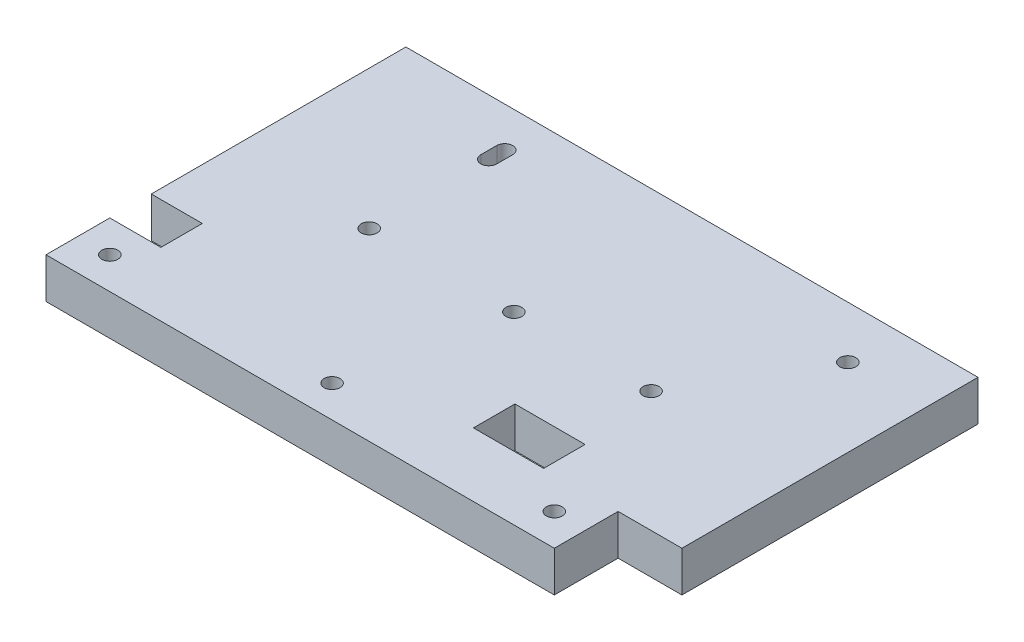
ISO-10303-21;
HEADER;
FILE_DESCRIPTION(('STEP AP214'),'2;1');
FILE_NAME('part.step','',(''),(''),'','','');
FILE_SCHEMA(('AUTOMOTIVE_DESIGN { 1 0 10303 214 1 1 1 1 }'));
ENDSEC;
DATA;
#1=APPLICATION_CONTEXT('core data for automotive mechanical design processes');
#2=APPLICATION_PROTOCOL_DEFINITION('international standard','automotive_design',2000,#1);
#3=PRODUCT_CONTEXT('',#1,'mechanical');
#4=PRODUCT('Part','Part','',(#3));
#5=PRODUCT_RELATED_PRODUCT_CATEGORY('part','',(#4));
#6=PRODUCT_DEFINITION_FORMATION('','',#4);
#7=PRODUCT_DEFINITION_CONTEXT('part definition',#1,'design');
#8=PRODUCT_DEFINITION('design','',#6,#7);
#9=PRODUCT_DEFINITION_SHAPE('','',#8);
#10=(LENGTH_UNIT() NAMED_UNIT(*) SI_UNIT(.MILLI.,.METRE.));
#11=(NAMED_UNIT(*) PLANE_ANGLE_UNIT() SI_UNIT($,.RADIAN.));
#12=(NAMED_UNIT(*) SI_UNIT($,.STERADIAN.) SOLID_ANGLE_UNIT());
#13=UNCERTAINTY_MEASURE_WITH_UNIT(LENGTH_MEASURE(1.E-05),#10,'distance_accuracy_value','');
#14=(GEOMETRIC_REPRESENTATION_CONTEXT(3) GLOBAL_UNCERTAINTY_ASSIGNED_CONTEXT((#13)) GLOBAL_UNIT_ASSIGNED_CONTEXT((#10,
#11,#12)) REPRESENTATION_CONTEXT('',''));
#15=CARTESIAN_POINT('',(0.,0.,0.));
#16=DIRECTION('',(0.,0.,1.));
#17=DIRECTION('',(1.,0.,0.));
#18=AXIS2_PLACEMENT_3D('',#15,#16,#17);
#19=CARTESIAN_POINT('',(0.,6.35,0.));
#20=DIRECTION('',(0.,-1.,0.));
#21=DIRECTION('',(0.,0.,-1.));
#22=AXIS2_PLACEMENT_3D('',#19,#20,#21);
#23=PLANE('',#22);
#24=CARTESIAN_POINT('',(149.35,6.35,-10.));
#25=DIRECTION('',(0.,1.,0.));
#26=DIRECTION('',(0.,0.,1.));
#27=AXIS2_PLACEMENT_3D('',#24,#25,#26);
#28=CIRCLE('',#27,2.5);
#29=CARTESIAN_POINT('',(149.35,6.35,-7.50000000000001));
#30=VERTEX_POINT('',#29);
#31=EDGE_CURVE('E193',#30,#30,#28,.T.);
#32=ORIENTED_EDGE('',*,*,#31,.F.);
#33=EDGE_LOOP('',(#32));
#34=FACE_BOUND('',#33,.T.);
#35=CARTESIAN_POINT('',(79.675,6.35,-10.));
#36=DIRECTION('',(0.,1.,0.));
#37=DIRECTION('',(0.,0.,1.));
#38=AXIS2_PLACEMENT_3D('',#35,#36,#37);
#39=CIRCLE('',#38,2.5);
#40=CARTESIAN_POINT('',(79.675,6.35,-7.50000000000001));
#41=VERTEX_POINT('',#40);
#42=EDGE_CURVE('E199',#41,#41,#39,.T.);
#43=ORIENTED_EDGE('',*,*,#42,.F.);
#44=EDGE_LOOP('',(#43));
#45=FACE_BOUND('',#44,.T.);
#46=CARTESIAN_POINT('',(10.,6.35,-10.));
#47=DIRECTION('',(0.,1.,0.));
#48=DIRECTION('',(0.,0.,1.));
#49=AXIS2_PLACEMENT_3D('',#46,#47,#48);
#50=CIRCLE('',#49,2.5);
#51=CARTESIAN_POINT('',(10.,6.35,-7.5));
#52=VERTEX_POINT('',#51);
#53=EDGE_CURVE('E205',#52,#52,#50,.T.);
#54=ORIENTED_EDGE('',*,*,#53,.F.);
#55=EDGE_LOOP('',(#54));
#56=FACE_BOUND('',#55,.T.);
#57=CARTESIAN_POINT('',(43.4871752699051,6.35,-95.32));
#58=DIRECTION('',(0.,1.,0.));
#59=DIRECTION('',(0.,0.,1.));
#60=AXIS2_PLACEMENT_3D('',#57,#58,#59);
#61=CIRCLE('',#60,2.5);
#62=CARTESIAN_POINT('',(40.9871752699051,6.35,-95.32));
#63=VERTEX_POINT('',#62);
#64=CARTESIAN_POINT('',(45.9871752699051,6.35,-95.32));
#65=VERTEX_POINT('',#64);
#66=EDGE_CURVE('E211',#63,#65,#61,.T.);
#67=ORIENTED_EDGE('',*,*,#66,.F.);
#68=DIRECTION('',(0.,0.,1.));
#69=VECTOR('',#68,1.);
#70=CARTESIAN_POINT('',(40.9871752699051,6.35,-95.32));
#71=LINE('',#70,#69);
#72=CARTESIAN_POINT('',(40.9871752699051,6.35,-100.32));
#73=VERTEX_POINT('',#72);
#74=EDGE_CURVE('E219',#73,#63,#71,.T.);
#75=ORIENTED_EDGE('',*,*,#74,.F.);
#76=CARTESIAN_POINT('',(43.4871752699051,6.35,-100.32));
#77=DIRECTION('',(0.,1.,0.));
#78=DIRECTION('',(0.,0.,1.));
#79=AXIS2_PLACEMENT_3D('',#76,#77,#78);
#80=CIRCLE('',#79,2.5);
#81=CARTESIAN_POINT('',(45.9871752699051,6.35,-100.32));
#82=VERTEX_POINT('',#81);
#83=EDGE_CURVE('E216',#82,#73,#80,.T.);
#84=ORIENTED_EDGE('',*,*,#83,.F.);
#85=DIRECTION('',(0.,0.,-1.));
#86=VECTOR('',#85,1.);
#87=CARTESIAN_POINT('',(45.9871752699051,6.35,-95.32));
#88=LINE('',#87,#86);
#89=EDGE_CURVE('E213',#65,#82,#88,.T.);
#90=ORIENTED_EDGE('',*,*,#89,.F.);
#91=EDGE_LOOP('',(#67,#75,#84,#90));
#92=FACE_BOUND('',#91,.T.);
#93=DIRECTION('',(0.,0.,1.));
#94=VECTOR('',#93,1.);
#95=CARTESIAN_POINT('',(0.,6.35,0.));
#96=LINE('',#95,#94);
#97=CARTESIAN_POINT('',(0.,6.35,-20.));
#98=VERTEX_POINT('',#97);
#99=CARTESIAN_POINT('',(0.,6.35,0.));
#100=VERTEX_POINT('',#99);
#101=EDGE_CURVE('E266',#98,#100,#96,.T.);
#102=ORIENTED_EDGE('',*,*,#101,.T.);
#103=DIRECTION('',(1.,0.,0.));
#104=VECTOR('',#103,1.);
#105=CARTESIAN_POINT('',(0.,6.35,0.));
#106=LINE('',#105,#104);
#107=CARTESIAN_POINT('',(159.35,6.35,0.));
#108=VERTEX_POINT('',#107);
#109=EDGE_CURVE('E269',#100,#108,#106,.T.);
#110=ORIENTED_EDGE('',*,*,#109,.T.);
#111=DIRECTION('',(0.,0.,-1.));
#112=VECTOR('',#111,1.);
#113=CARTESIAN_POINT('',(159.35,6.35,0.));
#114=LINE('',#113,#112);
#115=CARTESIAN_POINT('',(159.35,6.35,-20.));
#116=VERTEX_POINT('',#115);
#117=EDGE_CURVE('E272',#108,#116,#114,.T.);
#118=ORIENTED_EDGE('',*,*,#117,.T.);
#119=DIRECTION('',(1.,0.,0.));
#120=VECTOR('',#119,1.);
#121=CARTESIAN_POINT('',(159.35,6.35,-20.));
#122=LINE('',#121,#120);
#123=CARTESIAN_POINT('',(179.35,6.35,-20.));
#124=VERTEX_POINT('',#123);
#125=EDGE_CURVE('E274',#116,#124,#122,.T.);
#126=ORIENTED_EDGE('',*,*,#125,.T.);
#127=DIRECTION('',(0.,0.,-1.));
#128=VECTOR('',#127,1.);
#129=CARTESIAN_POINT('',(179.35,6.35,-112.82));
#130=LINE('',#129,#128);
#131=CARTESIAN_POINT('',(179.35,6.35,-112.82));
#132=VERTEX_POINT('',#131);
#133=EDGE_CURVE('E276',#124,#132,#130,.T.);
#134=ORIENTED_EDGE('',*,*,#133,.T.);
#135=DIRECTION('',(-1.,0.,0.));
#136=VECTOR('',#135,1.);
#137=CARTESIAN_POINT('',(0.,6.35,-112.82));
#138=LINE('',#137,#136);
#139=CARTESIAN_POINT('',(0.,6.35,-112.82));
#140=VERTEX_POINT('',#139);
#141=EDGE_CURVE('E278',#132,#140,#138,.T.);
#142=ORIENTED_EDGE('',*,*,#141,.T.);
#143=DIRECTION('',(0.,0.,1.));
#144=VECTOR('',#143,1.);
#145=CARTESIAN_POINT('',(0.,6.35,-33.));
#146=LINE('',#145,#144);
#147=CARTESIAN_POINT('',(0.,6.35,-33.));
#148=VERTEX_POINT('',#147);
#149=EDGE_CURVE('E280',#140,#148,#146,.T.);
#150=ORIENTED_EDGE('',*,*,#149,.T.);
#151=DIRECTION('',(1.,0.,0.));
#152=VECTOR('',#151,1.);
#153=CARTESIAN_POINT('',(16.,6.35,-33.));
#154=LINE('',#153,#152);
#155=CARTESIAN_POINT('',(16.,6.35,-33.));
#156=VERTEX_POINT('',#155);
#157=EDGE_CURVE('E282',#148,#156,#154,.T.);
#158=ORIENTED_EDGE('',*,*,#157,.T.);
#159=DIRECTION('',(0.,0.,1.));
#160=VECTOR('',#159,1.);
#161=CARTESIAN_POINT('',(16.,6.35,-20.));
#162=LINE('',#161,#160);
#163=CARTESIAN_POINT('',(16.,6.35,-20.));
#164=VERTEX_POINT('',#163);
#165=EDGE_CURVE('E284',#156,#164,#162,.T.);
#166=ORIENTED_EDGE('',*,*,#165,.T.);
#167=DIRECTION('',(-1.,0.,0.));
#168=VECTOR('',#167,1.);
#169=CARTESIAN_POINT('',(0.,6.35,-20.));
#170=LINE('',#169,#168);
#171=EDGE_CURVE('E286',#164,#98,#170,.T.);
#172=ORIENTED_EDGE('',*,*,#171,.T.);
#173=EDGE_LOOP('',(#102,#110,#118,#126,#134,#142,#150,#158,#166,#172));
#174=FACE_BOUND('',#173,.T.);
#175=CARTESIAN_POINT('',(43.4871752699051,6.35,-57.82));
#176=DIRECTION('',(0.,1.,0.));
#177=DIRECTION('',(0.,0.,1.));
#178=AXIS2_PLACEMENT_3D('',#175,#176,#177);
#179=CIRCLE('',#178,2.49999999999997);
#180=CARTESIAN_POINT('',(43.4871752699051,6.35,-55.32));
#181=VERTEX_POINT('',#180);
#182=EDGE_CURVE('E260',#181,#181,#179,.T.);
#183=ORIENTED_EDGE('',*,*,#182,.F.);
#184=EDGE_LOOP('',(#183));
#185=FACE_BOUND('',#184,.T.);
#186=CARTESIAN_POINT('',(88.8628247300949,6.35,-57.82));
#187=DIRECTION('',(0.,1.,0.));
#188=DIRECTION('',(0.,0.,1.));
#189=AXIS2_PLACEMENT_3D('',#186,#187,#188);
#190=CIRCLE('',#189,2.5);
#191=CARTESIAN_POINT('',(88.8628247300949,6.35,-55.32));
#192=VERTEX_POINT('',#191);
#193=EDGE_CURVE('E254',#192,#192,#190,.T.);
#194=ORIENTED_EDGE('',*,*,#193,.F.);
#195=EDGE_LOOP('',(#194));
#196=FACE_BOUND('',#195,.T.);
#197=CARTESIAN_POINT('',(131.862824730095,6.35,-57.82));
#198=DIRECTION('',(0.,1.,0.));
#199=DIRECTION('',(0.,0.,1.));
#200=AXIS2_PLACEMENT_3D('',#197,#198,#199);
#201=CIRCLE('',#200,2.50000000000002);
#202=CARTESIAN_POINT('',(131.862824730095,6.35,-55.32));
#203=VERTEX_POINT('',#202);
#204=EDGE_CURVE('E248',#203,#203,#201,.T.);
#205=ORIENTED_EDGE('',*,*,#204,.F.);
#206=EDGE_LOOP('',(#205));
#207=FACE_BOUND('',#206,.T.);
#208=CARTESIAN_POINT('',(154.85,6.35,-96.5057825707412));
#209=DIRECTION('',(0.,1.,0.));
#210=DIRECTION('',(0.,0.,1.));
#211=AXIS2_PLACEMENT_3D('',#208,#209,#210);
#212=CIRCLE('',#211,2.5);
#213=CARTESIAN_POINT('',(154.85,6.35,-94.0057825707412));
#214=VERTEX_POINT('',#213);
#215=EDGE_CURVE('E242',#214,#214,#212,.T.);
#216=ORIENTED_EDGE('',*,*,#215,.F.);
#217=EDGE_LOOP('',(#216));
#218=FACE_BOUND('',#217,.T.);
#219=DIRECTION('',(0.,0.,1.));
#220=VECTOR('',#219,1.);
#221=CARTESIAN_POINT('',(114.,6.35,-33.));
#222=LINE('',#221,#220);
#223=CARTESIAN_POINT('',(114.,6.35,-33.));
#224=VERTEX_POINT('',#223);
#225=CARTESIAN_POINT('',(114.,6.35,-20.));
#226=VERTEX_POINT('',#225);
#227=EDGE_CURVE('E157',#224,#226,#222,.T.);
#228=ORIENTED_EDGE('',*,*,#227,.F.);
#229=DIRECTION('',(-1.,0.,0.));
#230=VECTOR('',#229,1.);
#231=CARTESIAN_POINT('',(114.,6.35,-33.));
#232=LINE('',#231,#230);
#233=CARTESIAN_POINT('',(136.,6.35,-33.));
#234=VERTEX_POINT('',#233);
#235=EDGE_CURVE('E179',#234,#224,#232,.T.);
#236=ORIENTED_EDGE('',*,*,#235,.F.);
#237=DIRECTION('',(0.,0.,-1.));
#238=VECTOR('',#237,1.);
#239=CARTESIAN_POINT('',(136.,6.35,-33.));
#240=LINE('',#239,#238);
#241=CARTESIAN_POINT('',(136.,6.35,-20.));
#242=VERTEX_POINT('',#241);
#243=EDGE_CURVE('E177',#242,#234,#240,.T.);
#244=ORIENTED_EDGE('',*,*,#243,.F.);
#245=DIRECTION('',(1.,0.,0.));
#246=VECTOR('',#245,1.);
#247=CARTESIAN_POINT('',(114.,6.35,-20.));
#248=LINE('',#247,#246);
#249=EDGE_CURVE('E165',#226,#242,#248,.T.);
#250=ORIENTED_EDGE('',*,*,#249,.F.);
#251=EDGE_LOOP('',(#228,#236,#244,#250));
#252=FACE_BOUND('',#251,.T.);
#253=ADVANCED_FACE('F32',(#34,#45,#56,#92,#174,#185,#196,#207,#218,#252),#23,.F.);
#254=CARTESIAN_POINT('',(0.,-6.35,0.));
#255=DIRECTION('',(0.,-1.,0.));
#256=DIRECTION('',(0.,0.,-1.));
#257=AXIS2_PLACEMENT_3D('',#254,#255,#256);
#258=PLANE('',#257);
#259=CARTESIAN_POINT('',(79.675,-6.35,-10.));
#260=DIRECTION('',(0.,1.,0.));
#261=DIRECTION('',(0.,0.,1.));
#262=AXIS2_PLACEMENT_3D('',#259,#260,#261);
#263=CIRCLE('',#262,2.5);
#264=CARTESIAN_POINT('',(79.675,-6.35,-7.50000000000001));
#265=VERTEX_POINT('',#264);
#266=EDGE_CURVE('E196',#265,#265,#263,.T.);
#267=ORIENTED_EDGE('',*,*,#266,.T.);
#268=EDGE_LOOP('',(#267));
#269=FACE_BOUND('',#268,.T.);
#270=DIRECTION('',(0.,0.,1.));
#271=VECTOR('',#270,1.);
#272=CARTESIAN_POINT('',(40.9871752699051,-6.35,-95.32));
#273=LINE('',#272,#271);
#274=CARTESIAN_POINT('',(40.9871752699051,-6.35,-100.32));
#275=VERTEX_POINT('',#274);
#276=CARTESIAN_POINT('',(40.9871752699051,-6.35,-95.32));
#277=VERTEX_POINT('',#276);
#278=EDGE_CURVE('E214',#275,#277,#273,.T.);
#279=ORIENTED_EDGE('',*,*,#278,.T.);
#280=CARTESIAN_POINT('',(43.4871752699051,-6.35,-95.32));
#281=DIRECTION('',(0.,1.,0.));
#282=DIRECTION('',(0.,0.,1.));
#283=AXIS2_PLACEMENT_3D('',#280,#281,#282);
#284=CIRCLE('',#283,2.5);
#285=CARTESIAN_POINT('',(45.9871752699051,-6.35,-95.32));
#286=VERTEX_POINT('',#285);
#287=EDGE_CURVE('E208',#277,#286,#284,.T.);
#288=ORIENTED_EDGE('',*,*,#287,.T.);
#289=DIRECTION('',(0.,0.,-1.));
#290=VECTOR('',#289,1.);
#291=CARTESIAN_POINT('',(45.9871752699051,-6.35,-95.32));
#292=LINE('',#291,#290);
#293=CARTESIAN_POINT('',(45.9871752699051,-6.35,-100.32));
#294=VERTEX_POINT('',#293);
#295=EDGE_CURVE('E224',#286,#294,#292,.T.);
#296=ORIENTED_EDGE('',*,*,#295,.T.);
#297=CARTESIAN_POINT('',(43.4871752699051,-6.35,-100.32));
#298=DIRECTION('',(0.,1.,0.));
#299=DIRECTION('',(0.,0.,1.));
#300=AXIS2_PLACEMENT_3D('',#297,#298,#299);
#301=CIRCLE('',#300,2.5);
#302=EDGE_CURVE('E227',#294,#275,#301,.T.);
#303=ORIENTED_EDGE('',*,*,#302,.T.);
#304=EDGE_LOOP('',(#279,#288,#296,#303));
#305=FACE_BOUND('',#304,.T.);
#306=CARTESIAN_POINT('',(154.85,-6.35,-96.5057825707412));
#307=DIRECTION('',(0.,1.,0.));
#308=DIRECTION('',(0.,0.,1.));
#309=AXIS2_PLACEMENT_3D('',#306,#307,#308);
#310=CIRCLE('',#309,2.5);
#311=CARTESIAN_POINT('',(154.85,-6.35,-94.0057825707412));
#312=VERTEX_POINT('',#311);
#313=EDGE_CURVE('E241',#312,#312,#310,.T.);
#314=ORIENTED_EDGE('',*,*,#313,.T.);
#315=EDGE_LOOP('',(#314));
#316=FACE_BOUND('',#315,.T.);
#317=CARTESIAN_POINT('',(88.8628247300949,-6.35,-57.82));
#318=DIRECTION('',(0.,1.,0.));
#319=DIRECTION('',(0.,0.,1.));
#320=AXIS2_PLACEMENT_3D('',#317,#318,#319);
#321=CIRCLE('',#320,2.5);
#322=CARTESIAN_POINT('',(88.8628247300949,-6.35,-55.32));
#323=VERTEX_POINT('',#322);
#324=EDGE_CURVE('E251',#323,#323,#321,.T.);
#325=ORIENTED_EDGE('',*,*,#324,.T.);
#326=EDGE_LOOP('',(#325));
#327=FACE_BOUND('',#326,.T.);
#328=DIRECTION('',(0.,0.,1.));
#329=VECTOR('',#328,1.);
#330=CARTESIAN_POINT('',(0.,-6.35,0.));
#331=LINE('',#330,#329);
#332=CARTESIAN_POINT('',(0.,-6.35,-20.));
#333=VERTEX_POINT('',#332);
#334=CARTESIAN_POINT('',(0.,-6.35,0.));
#335=VERTEX_POINT('',#334);
#336=EDGE_CURVE('E263',#333,#335,#331,.T.);
#337=ORIENTED_EDGE('',*,*,#336,.F.);
#338=DIRECTION('',(-1.,0.,0.));
#339=VECTOR('',#338,1.);
#340=CARTESIAN_POINT('',(0.,-6.35,-20.));
#341=LINE('',#340,#339);
#342=CARTESIAN_POINT('',(16.,-6.35,-20.));
#343=VERTEX_POINT('',#342);
#344=EDGE_CURVE('E270',#343,#333,#341,.T.);
#345=ORIENTED_EDGE('',*,*,#344,.F.);
#346=DIRECTION('',(0.,0.,1.));
#347=VECTOR('',#346,1.);
#348=CARTESIAN_POINT('',(16.,-6.35,-20.));
#349=LINE('',#348,#347);
#350=CARTESIAN_POINT('',(16.,-6.35,-33.));
#351=VERTEX_POINT('',#350);
#352=EDGE_CURVE('E305',#351,#343,#349,.T.);
#353=ORIENTED_EDGE('',*,*,#352,.F.);
#354=DIRECTION('',(1.,0.,0.));
#355=VECTOR('',#354,1.);
#356=CARTESIAN_POINT('',(16.,-6.35,-33.));
#357=LINE('',#356,#355);
#358=CARTESIAN_POINT('',(0.,-6.35,-33.));
#359=VERTEX_POINT('',#358);
#360=EDGE_CURVE('E303',#359,#351,#357,.T.);
#361=ORIENTED_EDGE('',*,*,#360,.F.);
#362=DIRECTION('',(0.,0.,1.));
#363=VECTOR('',#362,1.);
#364=CARTESIAN_POINT('',(0.,-6.35,-33.));
#365=LINE('',#364,#363);
#366=CARTESIAN_POINT('',(0.,-6.35,-112.82));
#367=VERTEX_POINT('',#366);
#368=EDGE_CURVE('E301',#367,#359,#365,.T.);
#369=ORIENTED_EDGE('',*,*,#368,.F.);
#370=DIRECTION('',(-1.,0.,0.));
#371=VECTOR('',#370,1.);
#372=CARTESIAN_POINT('',(0.,-6.35,-112.82));
#373=LINE('',#372,#371);
#374=CARTESIAN_POINT('',(179.35,-6.35,-112.82));
#375=VERTEX_POINT('',#374);
#376=EDGE_CURVE('E299',#375,#367,#373,.T.);
#377=ORIENTED_EDGE('',*,*,#376,.F.);
#378=DIRECTION('',(0.,0.,-1.));
#379=VECTOR('',#378,1.);
#380=CARTESIAN_POINT('',(179.35,-6.35,-112.82));
#381=LINE('',#380,#379);
#382=CARTESIAN_POINT('',(179.35,-6.35,-20.));
#383=VERTEX_POINT('',#382);
#384=EDGE_CURVE('E297',#383,#375,#381,.T.);
#385=ORIENTED_EDGE('',*,*,#384,.F.);
#386=DIRECTION('',(1.,0.,0.));
#387=VECTOR('',#386,1.);
#388=CARTESIAN_POINT('',(159.35,-6.35,-20.));
#389=LINE('',#388,#387);
#390=CARTESIAN_POINT('',(159.35,-6.35,-20.));
#391=VERTEX_POINT('',#390);
#392=EDGE_CURVE('E295',#391,#383,#389,.T.);
#393=ORIENTED_EDGE('',*,*,#392,.F.);
#394=DIRECTION('',(0.,0.,-1.));
#395=VECTOR('',#394,1.);
#396=CARTESIAN_POINT('',(159.35,-6.35,0.));
#397=LINE('',#396,#395);
#398=CARTESIAN_POINT('',(159.35,-6.35,0.));
#399=VERTEX_POINT('',#398);
#400=EDGE_CURVE('E293',#399,#391,#397,.T.);
#401=ORIENTED_EDGE('',*,*,#400,.F.);
#402=DIRECTION('',(1.,0.,0.));
#403=VECTOR('',#402,1.);
#404=CARTESIAN_POINT('',(0.,-6.35,0.));
#405=LINE('',#404,#403);
#406=EDGE_CURVE('E291',#335,#399,#405,.T.);
#407=ORIENTED_EDGE('',*,*,#406,.F.);
#408=EDGE_LOOP('',(#337,#345,#353,#361,#369,#377,#385,#393,#401,#407));
#409=FACE_BOUND('',#408,.T.);
#410=CARTESIAN_POINT('',(43.4871752699051,-6.35,-57.82));
#411=DIRECTION('',(0.,1.,0.));
#412=DIRECTION('',(0.,0.,1.));
#413=AXIS2_PLACEMENT_3D('',#410,#411,#412);
#414=CIRCLE('',#413,2.49999999999997);
#415=CARTESIAN_POINT('',(43.4871752699051,-6.35,-55.32));
#416=VERTEX_POINT('',#415);
#417=EDGE_CURVE('E257',#416,#416,#414,.T.);
#418=ORIENTED_EDGE('',*,*,#417,.T.);
#419=EDGE_LOOP('',(#418));
#420=FACE_BOUND('',#419,.T.);
#421=CARTESIAN_POINT('',(131.862824730095,-6.35,-57.82));
#422=DIRECTION('',(0.,1.,0.));
#423=DIRECTION('',(0.,0.,1.));
#424=AXIS2_PLACEMENT_3D('',#421,#422,#423);
#425=CIRCLE('',#424,2.50000000000002);
#426=CARTESIAN_POINT('',(131.862824730095,-6.35,-55.32));
#427=VERTEX_POINT('',#426);
#428=EDGE_CURVE('E245',#427,#427,#425,.T.);
#429=ORIENTED_EDGE('',*,*,#428,.T.);
#430=EDGE_LOOP('',(#429));
#431=FACE_BOUND('',#430,.T.);
#432=CARTESIAN_POINT('',(10.,-6.35,-10.));
#433=DIRECTION('',(0.,1.,0.));
#434=DIRECTION('',(0.,0.,1.));
#435=AXIS2_PLACEMENT_3D('',#432,#433,#434);
#436=CIRCLE('',#435,2.5);
#437=CARTESIAN_POINT('',(10.,-6.35,-7.5));
#438=VERTEX_POINT('',#437);
#439=EDGE_CURVE('E202',#438,#438,#436,.T.);
#440=ORIENTED_EDGE('',*,*,#439,.T.);
#441=EDGE_LOOP('',(#440));
#442=FACE_BOUND('',#441,.T.);
#443=CARTESIAN_POINT('',(149.35,-6.35,-10.));
#444=DIRECTION('',(0.,1.,0.));
#445=DIRECTION('',(0.,0.,1.));
#446=AXIS2_PLACEMENT_3D('',#443,#444,#445);
#447=CIRCLE('',#446,2.5);
#448=CARTESIAN_POINT('',(149.35,-6.35,-7.50000000000001));
#449=VERTEX_POINT('',#448);
#450=EDGE_CURVE('E173',#449,#449,#447,.T.);
#451=ORIENTED_EDGE('',*,*,#450,.T.);
#452=EDGE_LOOP('',(#451));
#453=FACE_BOUND('',#452,.T.);
#454=DIRECTION('',(-1.,0.,0.));
#455=VECTOR('',#454,1.);
#456=CARTESIAN_POINT('',(114.,-6.35,-33.));
#457=LINE('',#456,#455);
#458=CARTESIAN_POINT('',(136.,-6.35,-33.));
#459=VERTEX_POINT('',#458);
#460=CARTESIAN_POINT('',(114.,-6.35,-33.));
#461=VERTEX_POINT('',#460);
#462=EDGE_CURVE('E166',#459,#461,#457,.T.);
#463=ORIENTED_EDGE('',*,*,#462,.T.);
#464=DIRECTION('',(0.,0.,1.));
#465=VECTOR('',#464,1.);
#466=CARTESIAN_POINT('',(114.,-6.35,-33.));
#467=LINE('',#466,#465);
#468=CARTESIAN_POINT('',(114.,-6.35,-20.));
#469=VERTEX_POINT('',#468);
#470=EDGE_CURVE('E55',#461,#469,#467,.T.);
#471=ORIENTED_EDGE('',*,*,#470,.T.);
#472=DIRECTION('',(1.,0.,0.));
#473=VECTOR('',#472,1.);
#474=CARTESIAN_POINT('',(114.,-6.35,-20.));
#475=LINE('',#474,#473);
#476=CARTESIAN_POINT('',(136.,-6.35,-20.));
#477=VERTEX_POINT('',#476);
#478=EDGE_CURVE('E172',#469,#477,#475,.T.);
#479=ORIENTED_EDGE('',*,*,#478,.T.);
#480=DIRECTION('',(0.,0.,-1.));
#481=VECTOR('',#480,1.);
#482=CARTESIAN_POINT('',(136.,-6.35,-33.));
#483=LINE('',#482,#481);
#484=EDGE_CURVE('E185',#477,#459,#483,.T.);
#485=ORIENTED_EDGE('',*,*,#484,.T.);
#486=EDGE_LOOP('',(#463,#471,#479,#485));
#487=FACE_BOUND('',#486,.T.);
#488=ADVANCED_FACE('F341',(#269,#305,#316,#327,#409,#420,#431,#442,#453,#487),#258,.T.);
#489=CARTESIAN_POINT('',(0.,6.35,0.));
#490=DIRECTION('',(1.,0.,0.));
#491=DIRECTION('',(0.,0.,-1.));
#492=AXIS2_PLACEMENT_3D('',#489,#490,#491);
#493=PLANE('',#492);
#494=ORIENTED_EDGE('',*,*,#336,.T.);
#495=DIRECTION('',(0.,-1.,0.));
#496=VECTOR('',#495,1.);
#497=CARTESIAN_POINT('',(0.,6.35,0.));
#498=LINE('',#497,#496);
#499=EDGE_CURVE('E11',#100,#335,#498,.T.);
#500=ORIENTED_EDGE('',*,*,#499,.F.);
#501=ORIENTED_EDGE('',*,*,#101,.F.);
#502=DIRECTION('',(0.,-1.,0.));
#503=VECTOR('',#502,1.);
#504=CARTESIAN_POINT('',(0.,6.35,-20.));
#505=LINE('',#504,#503);
#506=EDGE_CURVE('E288',#98,#333,#505,.T.);
#507=ORIENTED_EDGE('',*,*,#506,.T.);
#508=EDGE_LOOP('',(#494,#500,#501,#507));
#509=FACE_BOUND('',#508,.T.);
#510=ADVANCED_FACE('F34',(#509),#493,.F.);
#511=CARTESIAN_POINT('',(0.,6.35,0.));
#512=DIRECTION('',(0.,0.,-1.));
#513=DIRECTION('',(-1.,0.,0.));
#514=AXIS2_PLACEMENT_3D('',#511,#512,#513);
#515=PLANE('',#514);
#516=ORIENTED_EDGE('',*,*,#406,.T.);
#517=DIRECTION('',(0.,-1.,0.));
#518=VECTOR('',#517,1.);
#519=CARTESIAN_POINT('',(159.35,6.35,0.));
#520=LINE('',#519,#518);
#521=EDGE_CURVE('E40',#108,#399,#520,.T.);
#522=ORIENTED_EDGE('',*,*,#521,.F.);
#523=ORIENTED_EDGE('',*,*,#109,.F.);
#524=ORIENTED_EDGE('',*,*,#499,.T.);
#525=EDGE_LOOP('',(#516,#522,#523,#524));
#526=FACE_BOUND('',#525,.T.);
#527=ADVANCED_FACE('F359',(#526),#515,.F.);
#528=CARTESIAN_POINT('',(159.35,6.35,0.));
#529=DIRECTION('',(-1.,0.,0.));
#530=DIRECTION('',(0.,0.,1.));
#531=AXIS2_PLACEMENT_3D('',#528,#529,#530);
#532=PLANE('',#531);
#533=ORIENTED_EDGE('',*,*,#400,.T.);
#534=DIRECTION('',(0.,-1.,0.));
#535=VECTOR('',#534,1.);
#536=CARTESIAN_POINT('',(159.35,6.35,-20.));
#537=LINE('',#536,#535);
#538=EDGE_CURVE('E328',#116,#391,#537,.T.);
#539=ORIENTED_EDGE('',*,*,#538,.F.);
#540=ORIENTED_EDGE('',*,*,#117,.F.);
#541=ORIENTED_EDGE('',*,*,#521,.T.);
#542=EDGE_LOOP('',(#533,#539,#540,#541));
#543=FACE_BOUND('',#542,.T.);
#544=ADVANCED_FACE('F335',(#543),#532,.F.);
#545=CARTESIAN_POINT('',(159.35,6.35,-20.));
#546=DIRECTION('',(0.,0.,-1.));
#547=DIRECTION('',(-1.,0.,0.));
#548=AXIS2_PLACEMENT_3D('',#545,#546,#547);
#549=PLANE('',#548);
#550=ORIENTED_EDGE('',*,*,#392,.T.);
#551=DIRECTION('',(0.,-1.,0.));
#552=VECTOR('',#551,1.);
#553=CARTESIAN_POINT('',(179.35,6.35,-20.));
#554=LINE('',#553,#552);
#555=EDGE_CURVE('E325',#124,#383,#554,.T.);
#556=ORIENTED_EDGE('',*,*,#555,.F.);
#557=ORIENTED_EDGE('',*,*,#125,.F.);
#558=ORIENTED_EDGE('',*,*,#538,.T.);
#559=EDGE_LOOP('',(#550,#556,#557,#558));
#560=FACE_BOUND('',#559,.T.);
#561=ADVANCED_FACE('F347',(#560),#549,.F.);
#562=CARTESIAN_POINT('',(179.35,6.35,-112.82));
#563=DIRECTION('',(-1.,0.,0.));
#564=DIRECTION('',(0.,0.,1.));
#565=AXIS2_PLACEMENT_3D('',#562,#563,#564);
#566=PLANE('',#565);
#567=ORIENTED_EDGE('',*,*,#384,.T.);
#568=DIRECTION('',(0.,-1.,0.));
#569=VECTOR('',#568,1.);
#570=CARTESIAN_POINT('',(179.35,6.35,-112.82));
#571=LINE('',#570,#569);
#572=EDGE_CURVE('E322',#132,#375,#571,.T.);
#573=ORIENTED_EDGE('',*,*,#572,.F.);
#574=ORIENTED_EDGE('',*,*,#133,.F.);
#575=ORIENTED_EDGE('',*,*,#555,.T.);
#576=EDGE_LOOP('',(#567,#573,#574,#575));
#577=FACE_BOUND('',#576,.T.);
#578=ADVANCED_FACE('F351',(#577),#566,.F.);
#579=CARTESIAN_POINT('',(0.,6.35,-112.82));
#580=DIRECTION('',(0.,0.,1.));
#581=DIRECTION('',(1.,0.,0.));
#582=AXIS2_PLACEMENT_3D('',#579,#580,#581);
#583=PLANE('',#582);
#584=ORIENTED_EDGE('',*,*,#376,.T.);
#585=DIRECTION('',(0.,-1.,0.));
#586=VECTOR('',#585,1.);
#587=CARTESIAN_POINT('',(0.,6.35,-112.82));
#588=LINE('',#587,#586);
#589=EDGE_CURVE('E319',#140,#367,#588,.T.);
#590=ORIENTED_EDGE('',*,*,#589,.F.);
#591=ORIENTED_EDGE('',*,*,#141,.F.);
#592=ORIENTED_EDGE('',*,*,#572,.T.);
#593=EDGE_LOOP('',(#584,#590,#591,#592));
#594=FACE_BOUND('',#593,.T.);
#595=ADVANCED_FACE('F382',(#594),#583,.F.);
#596=CARTESIAN_POINT('',(0.,6.35,-33.));
#597=DIRECTION('',(1.,0.,0.));
#598=DIRECTION('',(0.,0.,-1.));
#599=AXIS2_PLACEMENT_3D('',#596,#597,#598);
#600=PLANE('',#599);
#601=ORIENTED_EDGE('',*,*,#368,.T.);
#602=DIRECTION('',(0.,-1.,0.));
#603=VECTOR('',#602,1.);
#604=CARTESIAN_POINT('',(0.,6.35,-33.));
#605=LINE('',#604,#603);
#606=EDGE_CURVE('E316',#148,#359,#605,.T.);
#607=ORIENTED_EDGE('',*,*,#606,.F.);
#608=ORIENTED_EDGE('',*,*,#149,.F.);
#609=ORIENTED_EDGE('',*,*,#589,.T.);
#610=EDGE_LOOP('',(#601,#607,#608,#609));
#611=FACE_BOUND('',#610,.T.);
#612=ADVANCED_FACE('F379',(#611),#600,.F.);
#613=CARTESIAN_POINT('',(16.,6.35,-33.));
#614=DIRECTION('',(0.,0.,-1.));
#615=DIRECTION('',(-1.,0.,0.));
#616=AXIS2_PLACEMENT_3D('',#613,#614,#615);
#617=PLANE('',#616);
#618=ORIENTED_EDGE('',*,*,#360,.T.);
#619=DIRECTION('',(0.,-1.,0.));
#620=VECTOR('',#619,1.);
#621=CARTESIAN_POINT('',(16.,6.35,-33.));
#622=LINE('',#621,#620);
#623=EDGE_CURVE('E313',#156,#351,#622,.T.);
#624=ORIENTED_EDGE('',*,*,#623,.F.);
#625=ORIENTED_EDGE('',*,*,#157,.F.);
#626=ORIENTED_EDGE('',*,*,#606,.T.);
#627=EDGE_LOOP('',(#618,#624,#625,#626));
#628=FACE_BOUND('',#627,.T.);
#629=ADVANCED_FACE('F375',(#628),#617,.F.);
#630=CARTESIAN_POINT('',(16.,6.35,-20.));
#631=DIRECTION('',(1.,0.,0.));
#632=DIRECTION('',(0.,0.,-1.));
#633=AXIS2_PLACEMENT_3D('',#630,#631,#632);
#634=PLANE('',#633);
#635=ORIENTED_EDGE('',*,*,#352,.T.);
#636=DIRECTION('',(0.,-1.,0.));
#637=VECTOR('',#636,1.);
#638=CARTESIAN_POINT('',(16.,6.35,-20.));
#639=LINE('',#638,#637);
#640=EDGE_CURVE('E310',#164,#343,#639,.T.);
#641=ORIENTED_EDGE('',*,*,#640,.F.);
#642=ORIENTED_EDGE('',*,*,#165,.F.);
#643=ORIENTED_EDGE('',*,*,#623,.T.);
#644=EDGE_LOOP('',(#635,#641,#642,#643));
#645=FACE_BOUND('',#644,.T.);
#646=ADVANCED_FACE('F371',(#645),#634,.F.);
#647=CARTESIAN_POINT('',(0.,6.35,-20.));
#648=DIRECTION('',(0.,0.,1.));
#649=DIRECTION('',(1.,0.,0.));
#650=AXIS2_PLACEMENT_3D('',#647,#648,#649);
#651=PLANE('',#650);
#652=ORIENTED_EDGE('',*,*,#344,.T.);
#653=ORIENTED_EDGE('',*,*,#506,.F.);
#654=ORIENTED_EDGE('',*,*,#171,.F.);
#655=ORIENTED_EDGE('',*,*,#640,.T.);
#656=EDGE_LOOP('',(#652,#653,#654,#655));
#657=FACE_BOUND('',#656,.T.);
#658=ADVANCED_FACE('F366',(#657),#651,.F.);
#659=CARTESIAN_POINT('',(43.4871752699051,6.35,-57.82));
#660=DIRECTION('',(0.,-1.,0.));
#661=DIRECTION('',(0.,0.,-1.));
#662=AXIS2_PLACEMENT_3D('',#659,#660,#661);
#663=CYLINDRICAL_SURFACE('',#662,2.49999999999997);
#664=ORIENTED_EDGE('',*,*,#182,.T.);
#665=EDGE_LOOP('',(#664));
#666=FACE_BOUND('',#665,.T.);
#667=ORIENTED_EDGE('',*,*,#417,.F.);
#668=EDGE_LOOP('',(#667));
#669=FACE_BOUND('',#668,.T.);
#670=ADVANCED_FACE('F402',(#666,#669),#663,.F.);
#671=CARTESIAN_POINT('',(88.8628247300949,6.35,-57.82));
#672=DIRECTION('',(0.,-1.,0.));
#673=DIRECTION('',(0.,0.,-1.));
#674=AXIS2_PLACEMENT_3D('',#671,#672,#673);
#675=CYLINDRICAL_SURFACE('',#674,2.5);
#676=ORIENTED_EDGE('',*,*,#193,.T.);
#677=EDGE_LOOP('',(#676));
#678=FACE_BOUND('',#677,.T.);
#679=ORIENTED_EDGE('',*,*,#324,.F.);
#680=EDGE_LOOP('',(#679));
#681=FACE_BOUND('',#680,.T.);
#682=ADVANCED_FACE('F428',(#678,#681),#675,.F.);
#683=CARTESIAN_POINT('',(131.862824730095,6.35,-57.82));
#684=DIRECTION('',(0.,-1.,0.));
#685=DIRECTION('',(0.,0.,-1.));
#686=AXIS2_PLACEMENT_3D('',#683,#684,#685);
#687=CYLINDRICAL_SURFACE('',#686,2.50000000000002);
#688=ORIENTED_EDGE('',*,*,#204,.T.);
#689=EDGE_LOOP('',(#688));
#690=FACE_BOUND('',#689,.T.);
#691=ORIENTED_EDGE('',*,*,#428,.F.);
#692=EDGE_LOOP('',(#691));
#693=FACE_BOUND('',#692,.T.);
#694=ADVANCED_FACE('F435',(#690,#693),#687,.F.);
#695=CARTESIAN_POINT('',(154.85,6.35,-96.5057825707412));
#696=DIRECTION('',(0.,-1.,0.));
#697=DIRECTION('',(0.,0.,-1.));
#698=AXIS2_PLACEMENT_3D('',#695,#696,#697);
#699=CYLINDRICAL_SURFACE('',#698,2.5);
#700=ORIENTED_EDGE('',*,*,#215,.T.);
#701=EDGE_LOOP('',(#700));
#702=FACE_BOUND('',#701,.T.);
#703=ORIENTED_EDGE('',*,*,#313,.F.);
#704=EDGE_LOOP('',(#703));
#705=FACE_BOUND('',#704,.T.);
#706=ADVANCED_FACE('F442',(#702,#705),#699,.F.);
#707=CARTESIAN_POINT('',(43.4871752699051,6.35,-95.32));
#708=DIRECTION('',(0.,-1.,0.));
#709=DIRECTION('',(0.,0.,-1.));
#710=AXIS2_PLACEMENT_3D('',#707,#708,#709);
#711=CYLINDRICAL_SURFACE('',#710,2.5);
#712=ORIENTED_EDGE('',*,*,#287,.F.);
#713=DIRECTION('',(0.,-1.,0.));
#714=VECTOR('',#713,1.);
#715=CARTESIAN_POINT('',(40.9871752699051,6.35,-95.32));
#716=LINE('',#715,#714);
#717=EDGE_CURVE('E221',#63,#277,#716,.T.);
#718=ORIENTED_EDGE('',*,*,#717,.F.);
#719=ORIENTED_EDGE('',*,*,#66,.T.);
#720=DIRECTION('',(0.,-1.,0.));
#721=VECTOR('',#720,1.);
#722=CARTESIAN_POINT('',(45.9871752699051,6.35,-95.32));
#723=LINE('',#722,#721);
#724=EDGE_CURVE('E238',#65,#286,#723,.T.);
#725=ORIENTED_EDGE('',*,*,#724,.T.);
#726=EDGE_LOOP('',(#712,#718,#719,#725));
#727=FACE_BOUND('',#726,.T.);
#728=ADVANCED_FACE('F450',(#727),#711,.F.);
#729=CARTESIAN_POINT('',(45.9871752699051,6.35,-95.32));
#730=DIRECTION('',(-1.,0.,0.));
#731=DIRECTION('',(0.,0.,1.));
#732=AXIS2_PLACEMENT_3D('',#729,#730,#731);
#733=PLANE('',#732);
#734=ORIENTED_EDGE('',*,*,#295,.F.);
#735=ORIENTED_EDGE('',*,*,#724,.F.);
#736=ORIENTED_EDGE('',*,*,#89,.T.);
#737=DIRECTION('',(0.,-1.,0.));
#738=VECTOR('',#737,1.);
#739=CARTESIAN_POINT('',(45.9871752699051,6.35,-100.32));
#740=LINE('',#739,#738);
#741=EDGE_CURVE('E236',#82,#294,#740,.T.);
#742=ORIENTED_EDGE('',*,*,#741,.T.);
#743=EDGE_LOOP('',(#734,#735,#736,#742));
#744=FACE_BOUND('',#743,.T.);
#745=ADVANCED_FACE('F458',(#744),#733,.T.);
#746=CARTESIAN_POINT('',(43.4871752699051,6.35,-100.32));
#747=DIRECTION('',(0.,-1.,0.));
#748=DIRECTION('',(0.,0.,-1.));
#749=AXIS2_PLACEMENT_3D('',#746,#747,#748);
#750=CYLINDRICAL_SURFACE('',#749,2.5);
#751=ORIENTED_EDGE('',*,*,#302,.F.);
#752=ORIENTED_EDGE('',*,*,#741,.F.);
#753=ORIENTED_EDGE('',*,*,#83,.T.);
#754=DIRECTION('',(0.,-1.,0.));
#755=VECTOR('',#754,1.);
#756=CARTESIAN_POINT('',(40.9871752699051,6.35,-100.32));
#757=LINE('',#756,#755);
#758=EDGE_CURVE('E234',#73,#275,#757,.T.);
#759=ORIENTED_EDGE('',*,*,#758,.T.);
#760=EDGE_LOOP('',(#751,#752,#753,#759));
#761=FACE_BOUND('',#760,.T.);
#762=ADVANCED_FACE('F466',(#761),#750,.F.);
#763=CARTESIAN_POINT('',(40.9871752699051,6.35,-95.32));
#764=DIRECTION('',(1.,0.,0.));
#765=DIRECTION('',(0.,0.,-1.));
#766=AXIS2_PLACEMENT_3D('',#763,#764,#765);
#767=PLANE('',#766);
#768=ORIENTED_EDGE('',*,*,#278,.F.);
#769=ORIENTED_EDGE('',*,*,#758,.F.);
#770=ORIENTED_EDGE('',*,*,#74,.T.);
#771=ORIENTED_EDGE('',*,*,#717,.T.);
#772=EDGE_LOOP('',(#768,#769,#770,#771));
#773=FACE_BOUND('',#772,.T.);
#774=ADVANCED_FACE('F474',(#773),#767,.T.);
#775=CARTESIAN_POINT('',(10.,6.35,-10.));
#776=DIRECTION('',(0.,-1.,0.));
#777=DIRECTION('',(0.,0.,-1.));
#778=AXIS2_PLACEMENT_3D('',#775,#776,#777);
#779=CYLINDRICAL_SURFACE('',#778,2.5);
#780=ORIENTED_EDGE('',*,*,#53,.T.);
#781=EDGE_LOOP('',(#780));
#782=FACE_BOUND('',#781,.T.);
#783=ORIENTED_EDGE('',*,*,#439,.F.);
#784=EDGE_LOOP('',(#783));
#785=FACE_BOUND('',#784,.T.);
#786=ADVANCED_FACE('F482',(#782,#785),#779,.F.);
#787=CARTESIAN_POINT('',(79.675,6.35,-10.));
#788=DIRECTION('',(0.,-1.,0.));
#789=DIRECTION('',(0.,0.,-1.));
#790=AXIS2_PLACEMENT_3D('',#787,#788,#789);
#791=CYLINDRICAL_SURFACE('',#790,2.5);
#792=ORIENTED_EDGE('',*,*,#42,.T.);
#793=EDGE_LOOP('',(#792));
#794=FACE_BOUND('',#793,.T.);
#795=ORIENTED_EDGE('',*,*,#266,.F.);
#796=EDGE_LOOP('',(#795));
#797=FACE_BOUND('',#796,.T.);
#798=ADVANCED_FACE('F490',(#794,#797),#791,.F.);
#799=CARTESIAN_POINT('',(149.35,6.35,-10.));
#800=DIRECTION('',(0.,-1.,0.));
#801=DIRECTION('',(0.,0.,-1.));
#802=AXIS2_PLACEMENT_3D('',#799,#800,#801);
#803=CYLINDRICAL_SURFACE('',#802,2.5);
#804=ORIENTED_EDGE('',*,*,#31,.T.);
#805=EDGE_LOOP('',(#804));
#806=FACE_BOUND('',#805,.T.);
#807=ORIENTED_EDGE('',*,*,#450,.F.);
#808=EDGE_LOOP('',(#807));
#809=FACE_BOUND('',#808,.T.);
#810=ADVANCED_FACE('F498',(#806,#809),#803,.F.);
#811=CARTESIAN_POINT('',(114.,6.35,-33.));
#812=DIRECTION('',(1.,0.,0.));
#813=DIRECTION('',(0.,0.,-1.));
#814=AXIS2_PLACEMENT_3D('',#811,#812,#813);
#815=PLANE('',#814);
#816=ORIENTED_EDGE('',*,*,#470,.F.);
#817=DIRECTION('',(0.,-1.,0.));
#818=VECTOR('',#817,1.);
#819=CARTESIAN_POINT('',(114.,6.35,-33.));
#820=LINE('',#819,#818);
#821=EDGE_CURVE('E161',#224,#461,#820,.T.);
#822=ORIENTED_EDGE('',*,*,#821,.F.);
#823=ORIENTED_EDGE('',*,*,#227,.T.);
#824=DIRECTION('',(0.,-1.,0.));
#825=VECTOR('',#824,1.);
#826=CARTESIAN_POINT('',(114.,6.35,-20.));
#827=LINE('',#826,#825);
#828=EDGE_CURVE('E160',#226,#469,#827,.T.);
#829=ORIENTED_EDGE('',*,*,#828,.T.);
#830=EDGE_LOOP('',(#816,#822,#823,#829));
#831=FACE_BOUND('',#830,.T.);
#832=ADVANCED_FACE('F159',(#831),#815,.T.);
#833=CARTESIAN_POINT('',(114.,6.35,-20.));
#834=DIRECTION('',(0.,0.,-1.));
#835=DIRECTION('',(-1.,0.,0.));
#836=AXIS2_PLACEMENT_3D('',#833,#834,#835);
#837=PLANE('',#836);
#838=ORIENTED_EDGE('',*,*,#478,.F.);
#839=ORIENTED_EDGE('',*,*,#828,.F.);
#840=ORIENTED_EDGE('',*,*,#249,.T.);
#841=DIRECTION('',(0.,-1.,0.));
#842=VECTOR('',#841,1.);
#843=CARTESIAN_POINT('',(136.,6.35,-20.));
#844=LINE('',#843,#842);
#845=EDGE_CURVE('E174',#242,#477,#844,.T.);
#846=ORIENTED_EDGE('',*,*,#845,.T.);
#847=EDGE_LOOP('',(#838,#839,#840,#846));
#848=FACE_BOUND('',#847,.T.);
#849=ADVANCED_FACE('F169',(#848),#837,.T.);
#850=CARTESIAN_POINT('',(136.,6.35,-33.));
#851=DIRECTION('',(-1.,0.,0.));
#852=DIRECTION('',(0.,0.,1.));
#853=AXIS2_PLACEMENT_3D('',#850,#851,#852);
#854=PLANE('',#853);
#855=ORIENTED_EDGE('',*,*,#484,.F.);
#856=ORIENTED_EDGE('',*,*,#845,.F.);
#857=ORIENTED_EDGE('',*,*,#243,.T.);
#858=DIRECTION('',(0.,-1.,0.));
#859=VECTOR('',#858,1.);
#860=CARTESIAN_POINT('',(136.,6.35,-33.));
#861=LINE('',#860,#859);
#862=EDGE_CURVE('E47',#234,#459,#861,.T.);
#863=ORIENTED_EDGE('',*,*,#862,.T.);
#864=EDGE_LOOP('',(#855,#856,#857,#863));
#865=FACE_BOUND('',#864,.T.);
#866=ADVANCED_FACE('F519',(#865),#854,.T.);
#867=CARTESIAN_POINT('',(114.,6.35,-33.));
#868=DIRECTION('',(0.,0.,1.));
#869=DIRECTION('',(1.,0.,0.));
#870=AXIS2_PLACEMENT_3D('',#867,#868,#869);
#871=PLANE('',#870);
#872=ORIENTED_EDGE('',*,*,#462,.F.);
#873=ORIENTED_EDGE('',*,*,#862,.F.);
#874=ORIENTED_EDGE('',*,*,#235,.T.);
#875=ORIENTED_EDGE('',*,*,#821,.T.);
#876=EDGE_LOOP('',(#872,#873,#874,#875));
#877=FACE_BOUND('',#876,.T.);
#878=ADVANCED_FACE('F526',(#877),#871,.T.);
#879=CLOSED_SHELL('',(#253,#488,#510,#527,#544,#561,#578,#595,#612,#629,#646,#658,#670,#682,
#694,#706,#728,#745,#762,#774,#786,#798,#810,#832,#849,#866,#878));
#880=MANIFOLD_SOLID_BREP('B2',#879);
#881=ADVANCED_BREP_SHAPE_REPRESENTATION('',(#18,#880),#14);
#882=SHAPE_DEFINITION_REPRESENTATION(#9,#881);
ENDSEC;
END-ISO-10303-21;
